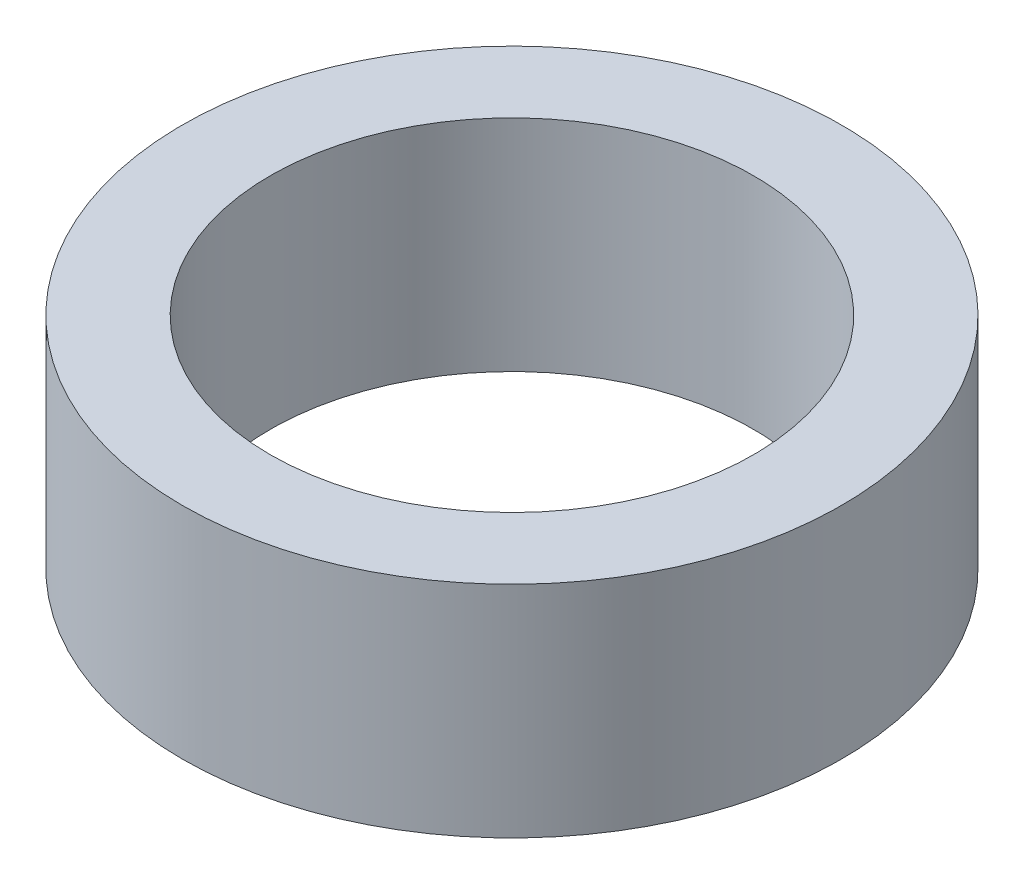
ISO-10303-21;
HEADER;
FILE_DESCRIPTION(('STEP AP214'),'2;1');
FILE_NAME('part.step','',(''),(''),'','','');
FILE_SCHEMA(('AUTOMOTIVE_DESIGN { 1 0 10303 214 1 1 1 1 }'));
ENDSEC;
DATA;
#1=APPLICATION_CONTEXT('core data for automotive mechanical design processes');
#2=APPLICATION_PROTOCOL_DEFINITION('international standard','automotive_design',2000,#1);
#3=PRODUCT_CONTEXT('',#1,'mechanical');
#4=PRODUCT('Part','Part','',(#3));
#5=PRODUCT_RELATED_PRODUCT_CATEGORY('part','',(#4));
#6=PRODUCT_DEFINITION_FORMATION('','',#4);
#7=PRODUCT_DEFINITION_CONTEXT('part definition',#1,'design');
#8=PRODUCT_DEFINITION('design','',#6,#7);
#9=PRODUCT_DEFINITION_SHAPE('','',#8);
#10=(LENGTH_UNIT() NAMED_UNIT(*) SI_UNIT(.MILLI.,.METRE.));
#11=(NAMED_UNIT(*) PLANE_ANGLE_UNIT() SI_UNIT($,.RADIAN.));
#12=(NAMED_UNIT(*) SI_UNIT($,.STERADIAN.) SOLID_ANGLE_UNIT());
#13=UNCERTAINTY_MEASURE_WITH_UNIT(LENGTH_MEASURE(1.E-05),#10,'distance_accuracy_value','');
#14=(GEOMETRIC_REPRESENTATION_CONTEXT(3) GLOBAL_UNCERTAINTY_ASSIGNED_CONTEXT((#13)) GLOBAL_UNIT_ASSIGNED_CONTEXT((#10,
#11,#12)) REPRESENTATION_CONTEXT('',''));
#15=CARTESIAN_POINT('',(0.,0.,0.));
#16=DIRECTION('',(0.,0.,1.));
#17=DIRECTION('',(1.,0.,0.));
#18=AXIS2_PLACEMENT_3D('',#15,#16,#17);
#19=CARTESIAN_POINT('',(0.,2.5,0.));
#20=DIRECTION('',(0.,1.,0.));
#21=DIRECTION('',(0.,0.,1.));
#22=AXIS2_PLACEMENT_3D('',#19,#20,#21);
#23=PLANE('',#22);
#24=CARTESIAN_POINT('',(0.,2.5,0.));
#25=DIRECTION('',(0.,1.,0.));
#26=DIRECTION('',(0.,0.,1.));
#27=AXIS2_PLACEMENT_3D('',#24,#25,#26);
#28=CIRCLE('',#27,3.75);
#29=CARTESIAN_POINT('',(0.,2.5,3.75));
#30=VERTEX_POINT('',#29);
#31=EDGE_CURVE('E10',#30,#30,#28,.T.);
#32=ORIENTED_EDGE('',*,*,#31,.T.);
#33=EDGE_LOOP('',(#32));
#34=FACE_BOUND('',#33,.T.);
#35=CARTESIAN_POINT('',(0.,2.5,0.));
#36=DIRECTION('',(0.,1.,0.));
#37=DIRECTION('',(0.,0.,1.));
#38=AXIS2_PLACEMENT_3D('',#35,#36,#37);
#39=CIRCLE('',#38,2.75);
#40=CARTESIAN_POINT('',(0.,2.5,2.75));
#41=VERTEX_POINT('',#40);
#42=EDGE_CURVE('E44',#41,#41,#39,.T.);
#43=ORIENTED_EDGE('',*,*,#42,.F.);
#44=EDGE_LOOP('',(#43));
#45=FACE_BOUND('',#44,.T.);
#46=ADVANCED_FACE('F33',(#34,#45),#23,.T.);
#47=CARTESIAN_POINT('',(0.,0.,0.));
#48=DIRECTION('',(0.,1.,0.));
#49=DIRECTION('',(0.,0.,1.));
#50=AXIS2_PLACEMENT_3D('',#47,#48,#49);
#51=PLANE('',#50);
#52=CARTESIAN_POINT('',(0.,0.,0.));
#53=DIRECTION('',(0.,1.,0.));
#54=DIRECTION('',(0.,0.,1.));
#55=AXIS2_PLACEMENT_3D('',#52,#53,#54);
#56=CIRCLE('',#55,3.75);
#57=CARTESIAN_POINT('',(0.,0.,3.75));
#58=VERTEX_POINT('',#57);
#59=EDGE_CURVE('E37',#58,#58,#56,.T.);
#60=ORIENTED_EDGE('',*,*,#59,.F.);
#61=EDGE_LOOP('',(#60));
#62=FACE_BOUND('',#61,.T.);
#63=CARTESIAN_POINT('',(0.,0.,0.));
#64=DIRECTION('',(0.,1.,0.));
#65=DIRECTION('',(0.,0.,1.));
#66=AXIS2_PLACEMENT_3D('',#63,#64,#65);
#67=CIRCLE('',#66,2.75);
#68=CARTESIAN_POINT('',(0.,0.,2.75));
#69=VERTEX_POINT('',#68);
#70=EDGE_CURVE('E46',#69,#69,#67,.T.);
#71=ORIENTED_EDGE('',*,*,#70,.T.);
#72=EDGE_LOOP('',(#71));
#73=FACE_BOUND('',#72,.T.);
#74=ADVANCED_FACE('F56',(#62,#73),#51,.F.);
#75=CARTESIAN_POINT('',(0.,2.5,0.));
#76=DIRECTION('',(0.,-1.,0.));
#77=DIRECTION('',(0.,0.,-1.));
#78=AXIS2_PLACEMENT_3D('',#75,#76,#77);
#79=CYLINDRICAL_SURFACE('',#78,3.75);
#80=ORIENTED_EDGE('',*,*,#31,.F.);
#81=EDGE_LOOP('',(#80));
#82=FACE_BOUND('',#81,.T.);
#83=ORIENTED_EDGE('',*,*,#59,.T.);
#84=EDGE_LOOP('',(#83));
#85=FACE_BOUND('',#84,.T.);
#86=ADVANCED_FACE('F35',(#82,#85),#79,.T.);
#87=CARTESIAN_POINT('',(0.,2.5,0.));
#88=DIRECTION('',(0.,-1.,0.));
#89=DIRECTION('',(0.,0.,-1.));
#90=AXIS2_PLACEMENT_3D('',#87,#88,#89);
#91=CYLINDRICAL_SURFACE('',#90,2.75);
#92=ORIENTED_EDGE('',*,*,#42,.T.);
#93=EDGE_LOOP('',(#92));
#94=FACE_BOUND('',#93,.T.);
#95=ORIENTED_EDGE('',*,*,#70,.F.);
#96=EDGE_LOOP('',(#95));
#97=FACE_BOUND('',#96,.T.);
#98=ADVANCED_FACE('F52',(#94,#97),#91,.F.);
#99=CLOSED_SHELL('',(#46,#74,#86,#98));
#100=MANIFOLD_SOLID_BREP('B2',#99);
#101=ADVANCED_BREP_SHAPE_REPRESENTATION('',(#18,#100),#14);
#102=SHAPE_DEFINITION_REPRESENTATION(#9,#101);
ENDSEC;
END-ISO-10303-21;
